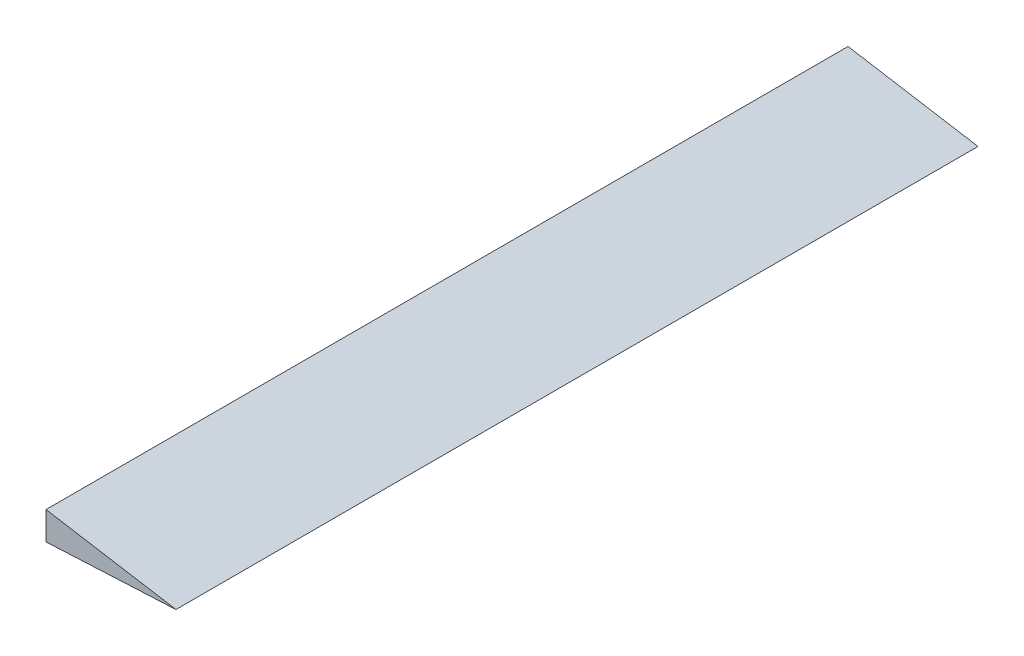
ISO-10303-21;
HEADER;
FILE_DESCRIPTION(('STEP AP214'),'2;1');
FILE_NAME('part.step','',(''),(''),'','','');
FILE_SCHEMA(('AUTOMOTIVE_DESIGN { 1 0 10303 214 1 1 1 1 }'));
ENDSEC;
DATA;
#1=APPLICATION_CONTEXT('core data for automotive mechanical design processes');
#2=APPLICATION_PROTOCOL_DEFINITION('international standard','automotive_design',2000,#1);
#3=PRODUCT_CONTEXT('',#1,'mechanical');
#4=PRODUCT('Part','Part','',(#3));
#5=PRODUCT_RELATED_PRODUCT_CATEGORY('part','',(#4));
#6=PRODUCT_DEFINITION_FORMATION('','',#4);
#7=PRODUCT_DEFINITION_CONTEXT('part definition',#1,'design');
#8=PRODUCT_DEFINITION('design','',#6,#7);
#9=PRODUCT_DEFINITION_SHAPE('','',#8);
#10=(LENGTH_UNIT() NAMED_UNIT(*) SI_UNIT(.MILLI.,.METRE.));
#11=(NAMED_UNIT(*) PLANE_ANGLE_UNIT() SI_UNIT($,.RADIAN.));
#12=(NAMED_UNIT(*) SI_UNIT($,.STERADIAN.) SOLID_ANGLE_UNIT());
#13=UNCERTAINTY_MEASURE_WITH_UNIT(LENGTH_MEASURE(1.E-05),#10,'distance_accuracy_value','');
#14=(GEOMETRIC_REPRESENTATION_CONTEXT(3) GLOBAL_UNCERTAINTY_ASSIGNED_CONTEXT((#13)) GLOBAL_UNIT_ASSIGNED_CONTEXT((#10,
#11,#12)) REPRESENTATION_CONTEXT('',''));
#15=CARTESIAN_POINT('',(0.,0.,0.));
#16=DIRECTION('',(0.,0.,1.));
#17=DIRECTION('',(1.,0.,0.));
#18=AXIS2_PLACEMENT_3D('',#15,#16,#17);
#19=CARTESIAN_POINT('',(306.849576799999,-2.51611574111238,-448.482466));
#20=DIRECTION('',(0.0494691955585382,-0.998775649828725,0.));
#21=DIRECTION('',(0.998775649828725,0.0494691955585382,0.));
#22=AXIS2_PLACEMENT_3D('',#19,#20,#21);
#23=PLANE('',#22);
#24=DIRECTION('',(-0.998775649828725,-0.0494691955585382,0.));
#25=VECTOR('',#24,1.);
#26=CARTESIAN_POINT('',(306.849576799999,-2.51611574111238,-761.999746));
#27=LINE('',#26,#25);
#28=CARTESIAN_POINT('',(357.6495768,0.,-761.999746));
#29=VERTEX_POINT('',#28);
#30=CARTESIAN_POINT('',(306.849576799999,-2.51611574111238,-761.999746));
#31=VERTEX_POINT('',#30);
#32=EDGE_CURVE('E97',#29,#31,#27,.T.);
#33=ORIENTED_EDGE('',*,*,#32,.F.);
#34=DIRECTION('',(0.,0.,-1.));
#35=VECTOR('',#34,1.);
#36=CARTESIAN_POINT('',(357.6495768,0.,-448.482466));
#37=LINE('',#36,#35);
#38=CARTESIAN_POINT('',(357.6495768,0.,-448.482466));
#39=VERTEX_POINT('',#38);
#40=EDGE_CURVE('E11',#39,#29,#37,.T.);
#41=ORIENTED_EDGE('',*,*,#40,.F.);
#42=DIRECTION('',(-0.998775649828725,-0.0494691955585382,0.));
#43=VECTOR('',#42,1.);
#44=CARTESIAN_POINT('',(306.849576799999,-2.51611574111238,-448.482466));
#45=LINE('',#44,#43);
#46=CARTESIAN_POINT('',(306.849576799999,-2.51611574111238,-448.482466));
#47=VERTEX_POINT('',#46);
#48=EDGE_CURVE('E85',#39,#47,#45,.T.);
#49=ORIENTED_EDGE('',*,*,#48,.T.);
#50=DIRECTION('',(0.,0.,-1.));
#51=VECTOR('',#50,1.);
#52=CARTESIAN_POINT('',(306.849576799999,-2.51611574111238,-448.482466));
#53=LINE('',#52,#51);
#54=EDGE_CURVE('E42',#47,#31,#53,.T.);
#55=ORIENTED_EDGE('',*,*,#54,.T.);
#56=EDGE_LOOP('',(#33,#41,#49,#55));
#57=FACE_BOUND('',#56,.T.);
#58=ADVANCED_FACE('F39',(#57),#23,.T.);
#59=CARTESIAN_POINT('',(306.8495768,8.44985600136988,-448.482466));
#60=DIRECTION('',(0.164081367708129,0.986446807877156,0.));
#61=DIRECTION('',(-0.986446807877156,0.164081367708129,0.));
#62=AXIS2_PLACEMENT_3D('',#59,#60,#61);
#63=PLANE('',#62);
#64=DIRECTION('',(0.986446807877156,-0.164081367708129,0.));
#65=VECTOR('',#64,1.);
#66=CARTESIAN_POINT('',(306.8495768,8.44985600136988,-761.999746));
#67=LINE('',#66,#65);
#68=CARTESIAN_POINT('',(306.8495768,8.44985600136988,-761.999746));
#69=VERTEX_POINT('',#68);
#70=EDGE_CURVE('E89',#69,#29,#67,.T.);
#71=ORIENTED_EDGE('',*,*,#70,.F.);
#72=DIRECTION('',(0.,0.,-1.));
#73=VECTOR('',#72,1.);
#74=CARTESIAN_POINT('',(306.8495768,8.44985600136988,-448.482466));
#75=LINE('',#74,#73);
#76=CARTESIAN_POINT('',(306.8495768,8.44985600136988,-448.482466));
#77=VERTEX_POINT('',#76);
#78=EDGE_CURVE('E49',#77,#69,#75,.T.);
#79=ORIENTED_EDGE('',*,*,#78,.F.);
#80=DIRECTION('',(0.986446807877156,-0.164081367708129,0.));
#81=VECTOR('',#80,1.);
#82=CARTESIAN_POINT('',(306.8495768,8.44985600136988,-448.482466));
#83=LINE('',#82,#81);
#84=EDGE_CURVE('E82',#77,#39,#83,.T.);
#85=ORIENTED_EDGE('',*,*,#84,.T.);
#86=ORIENTED_EDGE('',*,*,#40,.T.);
#87=EDGE_LOOP('',(#71,#79,#85,#86));
#88=FACE_BOUND('',#87,.T.);
#89=ADVANCED_FACE('F104',(#88),#63,.T.);
#90=CARTESIAN_POINT('',(306.849576799999,-2.51611574111238,-448.482466));
#91=DIRECTION('',(-1.,1.16428941119077E-13,0.));
#92=DIRECTION('',(-1.16428941119077E-13,-1.,0.));
#93=AXIS2_PLACEMENT_3D('',#90,#91,#92);
#94=PLANE('',#93);
#95=DIRECTION('',(1.16428941119077E-13,1.,0.));
#96=VECTOR('',#95,1.);
#97=CARTESIAN_POINT('',(306.849576799999,-2.51611574111238,-761.999746));
#98=LINE('',#97,#96);
#99=EDGE_CURVE('E79',#31,#69,#98,.T.);
#100=ORIENTED_EDGE('',*,*,#99,.F.);
#101=ORIENTED_EDGE('',*,*,#54,.F.);
#102=DIRECTION('',(1.16428941119077E-13,1.,0.));
#103=VECTOR('',#102,1.);
#104=CARTESIAN_POINT('',(306.849576799999,-2.51611574111238,-448.482466));
#105=LINE('',#104,#103);
#106=EDGE_CURVE('E77',#47,#77,#105,.T.);
#107=ORIENTED_EDGE('',*,*,#106,.T.);
#108=ORIENTED_EDGE('',*,*,#78,.T.);
#109=EDGE_LOOP('',(#100,#101,#107,#108));
#110=FACE_BOUND('',#109,.T.);
#111=ADVANCED_FACE('F76',(#110),#94,.T.);
#112=CARTESIAN_POINT('',(0.,0.,-448.482466));
#113=DIRECTION('',(0.,0.,1.));
#114=DIRECTION('',(1.,0.,0.));
#115=AXIS2_PLACEMENT_3D('',#112,#113,#114);
#116=PLANE('',#115);
#117=ORIENTED_EDGE('',*,*,#48,.F.);
#118=ORIENTED_EDGE('',*,*,#84,.F.);
#119=ORIENTED_EDGE('',*,*,#106,.F.);
#120=EDGE_LOOP('',(#117,#118,#119));
#121=FACE_BOUND('',#120,.T.);
#122=ADVANCED_FACE('F84',(#121),#116,.T.);
#123=CARTESIAN_POINT('',(0.,0.,-761.999746));
#124=DIRECTION('',(0.,0.,1.));
#125=DIRECTION('',(1.,0.,0.));
#126=AXIS2_PLACEMENT_3D('',#123,#124,#125);
#127=PLANE('',#126);
#128=ORIENTED_EDGE('',*,*,#32,.T.);
#129=ORIENTED_EDGE('',*,*,#99,.T.);
#130=ORIENTED_EDGE('',*,*,#70,.T.);
#131=EDGE_LOOP('',(#128,#129,#130));
#132=FACE_BOUND('',#131,.T.);
#133=ADVANCED_FACE('F103',(#132),#127,.F.);
#134=CLOSED_SHELL('',(#58,#89,#111,#122,#133));
#135=MANIFOLD_SOLID_BREP('B2',#134);
#136=ADVANCED_BREP_SHAPE_REPRESENTATION('',(#18,#135),#14);
#137=SHAPE_DEFINITION_REPRESENTATION(#9,#136);
ENDSEC;
END-ISO-10303-21;
